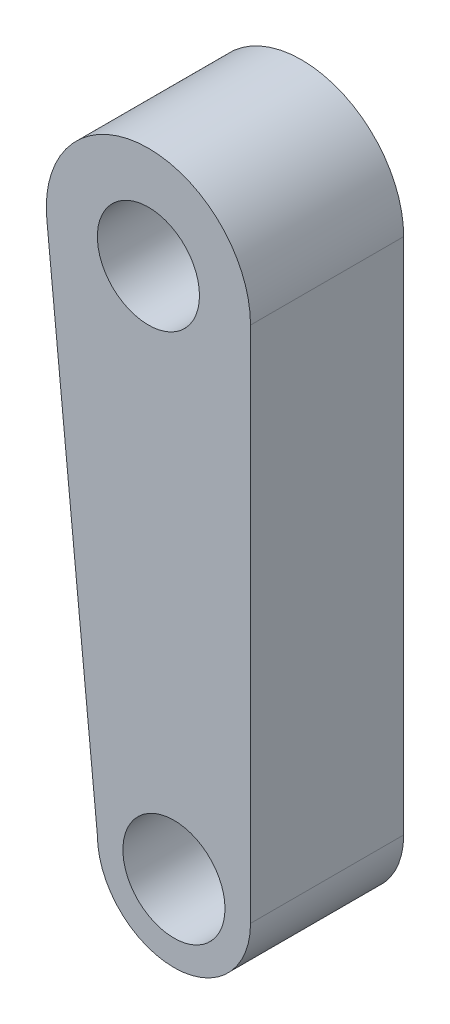
ISO-10303-21;
HEADER;
FILE_DESCRIPTION(('STEP AP214'),'2;1');
FILE_NAME('part.step','',(''),(''),'','','');
FILE_SCHEMA(('AUTOMOTIVE_DESIGN { 1 0 10303 214 1 1 1 1 }'));
ENDSEC;
DATA;
#1=APPLICATION_CONTEXT('core data for automotive mechanical design processes');
#2=APPLICATION_PROTOCOL_DEFINITION('international standard','automotive_design',2000,#1);
#3=PRODUCT_CONTEXT('',#1,'mechanical');
#4=PRODUCT('Part','Part','',(#3));
#5=PRODUCT_RELATED_PRODUCT_CATEGORY('part','',(#4));
#6=PRODUCT_DEFINITION_FORMATION('','',#4);
#7=PRODUCT_DEFINITION_CONTEXT('part definition',#1,'design');
#8=PRODUCT_DEFINITION('design','',#6,#7);
#9=PRODUCT_DEFINITION_SHAPE('','',#8);
#10=(LENGTH_UNIT() NAMED_UNIT(*) SI_UNIT(.MILLI.,.METRE.));
#11=(NAMED_UNIT(*) PLANE_ANGLE_UNIT() SI_UNIT($,.RADIAN.));
#12=(NAMED_UNIT(*) SI_UNIT($,.STERADIAN.) SOLID_ANGLE_UNIT());
#13=UNCERTAINTY_MEASURE_WITH_UNIT(LENGTH_MEASURE(1.E-05),#10,'distance_accuracy_value','');
#14=(GEOMETRIC_REPRESENTATION_CONTEXT(3) GLOBAL_UNCERTAINTY_ASSIGNED_CONTEXT((#13)) GLOBAL_UNIT_ASSIGNED_CONTEXT((#10,
#11,#12)) REPRESENTATION_CONTEXT('',''));
#15=CARTESIAN_POINT('',(0.,0.,0.));
#16=DIRECTION('',(0.,0.,1.));
#17=DIRECTION('',(1.,0.,0.));
#18=AXIS2_PLACEMENT_3D('',#15,#16,#17);
#19=CARTESIAN_POINT('',(-1.5,4.19721855802466,4.5));
#20=DIRECTION('',(0.,0.,1.));
#21=DIRECTION('',(1.,0.,0.));
#22=AXIS2_PLACEMENT_3D('',#19,#20,#21);
#23=PLANE('',#22);
#24=CARTESIAN_POINT('',(-1.5,4.19721855802466,4.5));
#25=DIRECTION('',(0.,0.,1.));
#26=DIRECTION('',(1.,0.,0.));
#27=AXIS2_PLACEMENT_3D('',#24,#25,#26);
#28=CIRCLE('',#27,1.5);
#29=CARTESIAN_POINT('',(0.,4.19721855802466,4.5));
#30=VERTEX_POINT('',#29);
#31=EDGE_CURVE('E103',#30,#30,#28,.T.);
#32=ORIENTED_EDGE('',*,*,#31,.F.);
#33=EDGE_LOOP('',(#32));
#34=FACE_BOUND('',#33,.T.);
#35=CARTESIAN_POINT('',(-1.5,4.19721855802466,4.5));
#36=DIRECTION('',(0.,0.,1.));
#37=DIRECTION('',(1.,0.,0.));
#38=AXIS2_PLACEMENT_3D('',#35,#36,#37);
#39=CIRCLE('',#38,3.);
#40=CARTESIAN_POINT('',(1.5,4.19721855802466,4.5));
#41=VERTEX_POINT('',#40);
#42=CARTESIAN_POINT('',(-4.48525718223814,3.90016712157703,4.5));
#43=VERTEX_POINT('',#42);
#44=EDGE_CURVE('E88',#41,#43,#39,.T.);
#45=ORIENTED_EDGE('',*,*,#44,.T.);
#46=DIRECTION('',(0.0990171454825428,-0.995085727412713,0.));
#47=VECTOR('',#46,1.);
#48=CARTESIAN_POINT('',(-4.48525718223814,3.90016712157703,4.5));
#49=LINE('',#48,#47);
#50=CARTESIAN_POINT('',(-3.,-11.0261187896137,4.5));
#51=VERTEX_POINT('',#50);
#52=EDGE_CURVE('E83',#43,#51,#49,.T.);
#53=ORIENTED_EDGE('',*,*,#52,.T.);
#54=CARTESIAN_POINT('',(-0.750000000000002,-11.0261187896137,4.5));
#55=DIRECTION('',(0.,0.,1.));
#56=DIRECTION('',(1.,0.,0.));
#57=AXIS2_PLACEMENT_3D('',#54,#55,#56);
#58=CIRCLE('',#57,2.25);
#59=CARTESIAN_POINT('',(1.5,-11.0261187896137,4.5));
#60=VERTEX_POINT('',#59);
#61=EDGE_CURVE('E86',#51,#60,#58,.T.);
#62=ORIENTED_EDGE('',*,*,#61,.T.);
#63=DIRECTION('',(0.,1.,0.));
#64=VECTOR('',#63,1.);
#65=CARTESIAN_POINT('',(1.5,4.19721855802466,4.5));
#66=LINE('',#65,#64);
#67=EDGE_CURVE('E53',#60,#41,#66,.T.);
#68=ORIENTED_EDGE('',*,*,#67,.T.);
#69=EDGE_LOOP('',(#45,#53,#62,#68));
#70=FACE_BOUND('',#69,.T.);
#71=CARTESIAN_POINT('',(-0.750000000000002,-11.0261187896137,4.5));
#72=DIRECTION('',(0.,0.,1.));
#73=DIRECTION('',(1.,0.,0.));
#74=AXIS2_PLACEMENT_3D('',#71,#72,#73);
#75=CIRCLE('',#74,1.5);
#76=CARTESIAN_POINT('',(0.749999999999999,-11.0261187896137,4.5));
#77=VERTEX_POINT('',#76);
#78=EDGE_CURVE('E118',#77,#77,#75,.T.);
#79=ORIENTED_EDGE('',*,*,#78,.F.);
#80=EDGE_LOOP('',(#79));
#81=FACE_BOUND('',#80,.T.);
#82=ADVANCED_FACE('F36',(#34,#70,#81),#23,.T.);
#83=CARTESIAN_POINT('',(-1.5,4.19721855802466,0.));
#84=DIRECTION('',(0.,0.,1.));
#85=DIRECTION('',(1.,0.,0.));
#86=AXIS2_PLACEMENT_3D('',#83,#84,#85);
#87=PLANE('',#86);
#88=CARTESIAN_POINT('',(-1.5,4.19721855802466,0.));
#89=DIRECTION('',(0.,0.,1.));
#90=DIRECTION('',(1.,0.,0.));
#91=AXIS2_PLACEMENT_3D('',#88,#89,#90);
#92=CIRCLE('',#91,3.);
#93=CARTESIAN_POINT('',(1.5,4.19721855802466,0.));
#94=VERTEX_POINT('',#93);
#95=CARTESIAN_POINT('',(-4.48525718223814,3.90016712157703,0.));
#96=VERTEX_POINT('',#95);
#97=EDGE_CURVE('E100',#94,#96,#92,.T.);
#98=ORIENTED_EDGE('',*,*,#97,.F.);
#99=DIRECTION('',(0.,1.,0.));
#100=VECTOR('',#99,1.);
#101=CARTESIAN_POINT('',(1.5,4.19721855802466,0.));
#102=LINE('',#101,#100);
#103=CARTESIAN_POINT('',(1.5,-11.0261187896137,0.));
#104=VERTEX_POINT('',#103);
#105=EDGE_CURVE('E76',#104,#94,#102,.T.);
#106=ORIENTED_EDGE('',*,*,#105,.F.);
#107=CARTESIAN_POINT('',(-0.750000000000002,-11.0261187896137,0.));
#108=DIRECTION('',(0.,0.,1.));
#109=DIRECTION('',(1.,0.,0.));
#110=AXIS2_PLACEMENT_3D('',#107,#108,#109);
#111=CIRCLE('',#110,2.25);
#112=CARTESIAN_POINT('',(-3.,-11.0261187896137,0.));
#113=VERTEX_POINT('',#112);
#114=EDGE_CURVE('E70',#113,#104,#111,.T.);
#115=ORIENTED_EDGE('',*,*,#114,.F.);
#116=DIRECTION('',(0.0990171454825428,-0.995085727412713,0.));
#117=VECTOR('',#116,1.);
#118=CARTESIAN_POINT('',(-4.48525718223814,3.90016712157703,0.));
#119=LINE('',#118,#117);
#120=EDGE_CURVE('E92',#96,#113,#119,.T.);
#121=ORIENTED_EDGE('',*,*,#120,.F.);
#122=EDGE_LOOP('',(#98,#106,#115,#121));
#123=FACE_BOUND('',#122,.T.);
#124=CARTESIAN_POINT('',(-1.5,4.19721855802466,0.));
#125=DIRECTION('',(0.,0.,1.));
#126=DIRECTION('',(1.,0.,0.));
#127=AXIS2_PLACEMENT_3D('',#124,#125,#126);
#128=CIRCLE('',#127,1.5);
#129=CARTESIAN_POINT('',(0.,4.19721855802466,0.));
#130=VERTEX_POINT('',#129);
#131=EDGE_CURVE('E115',#130,#130,#128,.T.);
#132=ORIENTED_EDGE('',*,*,#131,.T.);
#133=EDGE_LOOP('',(#132));
#134=FACE_BOUND('',#133,.T.);
#135=CARTESIAN_POINT('',(-0.750000000000002,-11.0261187896137,0.));
#136=DIRECTION('',(0.,0.,1.));
#137=DIRECTION('',(1.,0.,0.));
#138=AXIS2_PLACEMENT_3D('',#135,#136,#137);
#139=CIRCLE('',#138,1.5);
#140=CARTESIAN_POINT('',(0.749999999999999,-11.0261187896137,0.));
#141=VERTEX_POINT('',#140);
#142=EDGE_CURVE('E121',#141,#141,#139,.T.);
#143=ORIENTED_EDGE('',*,*,#142,.T.);
#144=EDGE_LOOP('',(#143));
#145=FACE_BOUND('',#144,.T.);
#146=ADVANCED_FACE('F111',(#123,#134,#145),#87,.F.);
#147=CARTESIAN_POINT('',(-1.5,4.19721855802466,4.5));
#148=DIRECTION('',(0.,0.,-1.));
#149=DIRECTION('',(-1.,0.,0.));
#150=AXIS2_PLACEMENT_3D('',#147,#148,#149);
#151=CYLINDRICAL_SURFACE('',#150,3.);
#152=ORIENTED_EDGE('',*,*,#97,.T.);
#153=DIRECTION('',(0.,0.,-1.));
#154=VECTOR('',#153,1.);
#155=CARTESIAN_POINT('',(-4.48525718223814,3.90016712157703,4.5));
#156=LINE('',#155,#154);
#157=EDGE_CURVE('E11',#43,#96,#156,.T.);
#158=ORIENTED_EDGE('',*,*,#157,.F.);
#159=ORIENTED_EDGE('',*,*,#44,.F.);
#160=DIRECTION('',(0.,0.,-1.));
#161=VECTOR('',#160,1.);
#162=CARTESIAN_POINT('',(1.5,4.19721855802466,4.5));
#163=LINE('',#162,#161);
#164=EDGE_CURVE('E96',#41,#94,#163,.T.);
#165=ORIENTED_EDGE('',*,*,#164,.T.);
#166=EDGE_LOOP('',(#152,#158,#159,#165));
#167=FACE_BOUND('',#166,.T.);
#168=ADVANCED_FACE('F38',(#167),#151,.T.);
#169=CARTESIAN_POINT('',(-4.48525718223814,3.90016712157703,4.5));
#170=DIRECTION('',(0.995085727412713,0.0990171454825428,0.));
#171=DIRECTION('',(-0.0990171454825429,0.995085727412714,0.));
#172=AXIS2_PLACEMENT_3D('',#169,#170,#171);
#173=PLANE('',#172);
#174=ORIENTED_EDGE('',*,*,#120,.T.);
#175=DIRECTION('',(0.,0.,-1.));
#176=VECTOR('',#175,1.);
#177=CARTESIAN_POINT('',(-3.,-11.0261187896137,4.5));
#178=LINE('',#177,#176);
#179=EDGE_CURVE('E45',#51,#113,#178,.T.);
#180=ORIENTED_EDGE('',*,*,#179,.F.);
#181=ORIENTED_EDGE('',*,*,#52,.F.);
#182=ORIENTED_EDGE('',*,*,#157,.T.);
#183=EDGE_LOOP('',(#174,#180,#181,#182));
#184=FACE_BOUND('',#183,.T.);
#185=ADVANCED_FACE('F91',(#184),#173,.F.);
#186=CARTESIAN_POINT('',(-0.750000000000002,-11.0261187896137,4.5));
#187=DIRECTION('',(0.,0.,-1.));
#188=DIRECTION('',(-1.,0.,0.));
#189=AXIS2_PLACEMENT_3D('',#186,#187,#188);
#190=CYLINDRICAL_SURFACE('',#189,2.25);
#191=ORIENTED_EDGE('',*,*,#114,.T.);
#192=DIRECTION('',(0.,0.,-1.));
#193=VECTOR('',#192,1.);
#194=CARTESIAN_POINT('',(1.5,-11.0261187896137,4.5));
#195=LINE('',#194,#193);
#196=EDGE_CURVE('E93',#60,#104,#195,.T.);
#197=ORIENTED_EDGE('',*,*,#196,.F.);
#198=ORIENTED_EDGE('',*,*,#61,.F.);
#199=ORIENTED_EDGE('',*,*,#179,.T.);
#200=EDGE_LOOP('',(#191,#197,#198,#199));
#201=FACE_BOUND('',#200,.T.);
#202=ADVANCED_FACE('F94',(#201),#190,.T.);
#203=CARTESIAN_POINT('',(1.5,4.19721855802466,4.5));
#204=DIRECTION('',(-1.,0.,0.));
#205=DIRECTION('',(0.,-1.,0.));
#206=AXIS2_PLACEMENT_3D('',#203,#204,#205);
#207=PLANE('',#206);
#208=ORIENTED_EDGE('',*,*,#105,.T.);
#209=ORIENTED_EDGE('',*,*,#164,.F.);
#210=ORIENTED_EDGE('',*,*,#67,.F.);
#211=ORIENTED_EDGE('',*,*,#196,.T.);
#212=EDGE_LOOP('',(#208,#209,#210,#211));
#213=FACE_BOUND('',#212,.T.);
#214=ADVANCED_FACE('F108',(#213),#207,.F.);
#215=CARTESIAN_POINT('',(-1.5,4.19721855802466,4.5));
#216=DIRECTION('',(0.,0.,-1.));
#217=DIRECTION('',(-1.,0.,0.));
#218=AXIS2_PLACEMENT_3D('',#215,#216,#217);
#219=CYLINDRICAL_SURFACE('',#218,1.5);
#220=ORIENTED_EDGE('',*,*,#31,.T.);
#221=EDGE_LOOP('',(#220));
#222=FACE_BOUND('',#221,.T.);
#223=ORIENTED_EDGE('',*,*,#131,.F.);
#224=EDGE_LOOP('',(#223));
#225=FACE_BOUND('',#224,.T.);
#226=ADVANCED_FACE('F138',(#222,#225),#219,.F.);
#227=CARTESIAN_POINT('',(-0.750000000000002,-11.0261187896137,4.5));
#228=DIRECTION('',(0.,0.,-1.));
#229=DIRECTION('',(-1.,0.,0.));
#230=AXIS2_PLACEMENT_3D('',#227,#228,#229);
#231=CYLINDRICAL_SURFACE('',#230,1.5);
#232=ORIENTED_EDGE('',*,*,#78,.T.);
#233=EDGE_LOOP('',(#232));
#234=FACE_BOUND('',#233,.T.);
#235=ORIENTED_EDGE('',*,*,#142,.F.);
#236=EDGE_LOOP('',(#235));
#237=FACE_BOUND('',#236,.T.);
#238=ADVANCED_FACE('F127',(#234,#237),#231,.F.);
#239=CLOSED_SHELL('',(#82,#146,#168,#185,#202,#214,#226,#238));
#240=MANIFOLD_SOLID_BREP('B2',#239);
#241=ADVANCED_BREP_SHAPE_REPRESENTATION('',(#18,#240),#14);
#242=SHAPE_DEFINITION_REPRESENTATION(#9,#241);
ENDSEC;
END-ISO-10303-21;
